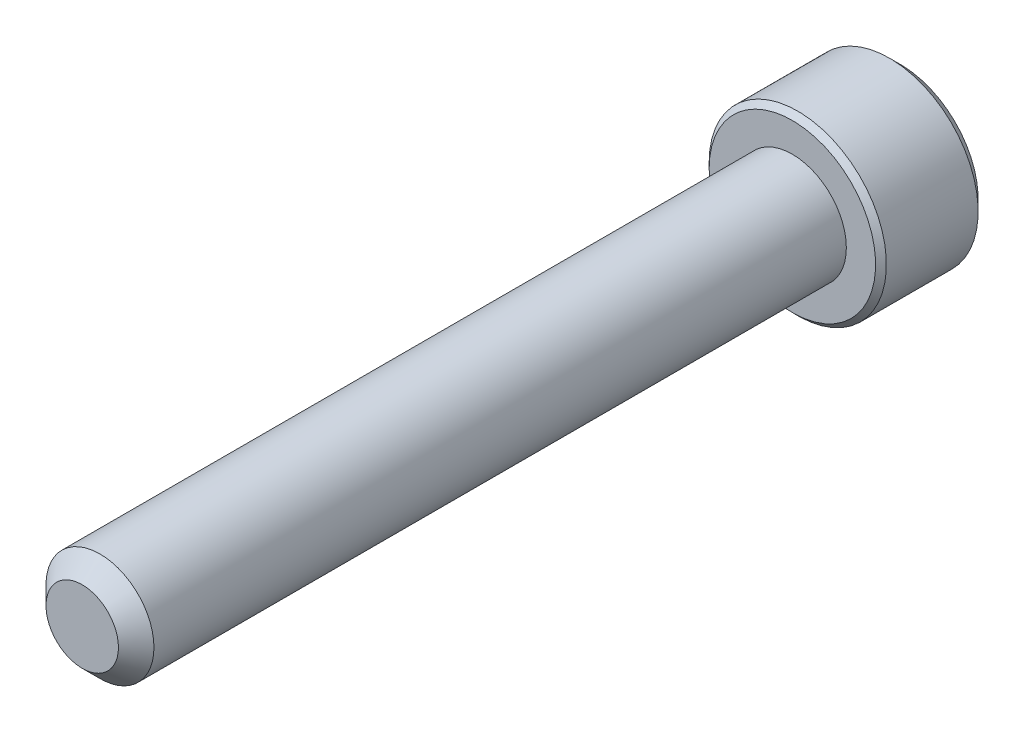
ISO-10303-21;
HEADER;
FILE_DESCRIPTION(('STEP AP214'),'2;1');
FILE_NAME('part.step','',(''),(''),'','','');
FILE_SCHEMA(('AUTOMOTIVE_DESIGN { 1 0 10303 214 1 1 1 1 }'));
ENDSEC;
DATA;
#1=APPLICATION_CONTEXT('core data for automotive mechanical design processes');
#2=APPLICATION_PROTOCOL_DEFINITION('international standard','automotive_design',2000,#1);
#3=PRODUCT_CONTEXT('',#1,'mechanical');
#4=PRODUCT('Part','Part','',(#3));
#5=PRODUCT_RELATED_PRODUCT_CATEGORY('part','',(#4));
#6=PRODUCT_DEFINITION_FORMATION('','',#4);
#7=PRODUCT_DEFINITION_CONTEXT('part definition',#1,'design');
#8=PRODUCT_DEFINITION('design','',#6,#7);
#9=PRODUCT_DEFINITION_SHAPE('','',#8);
#10=(LENGTH_UNIT() NAMED_UNIT(*) SI_UNIT(.MILLI.,.METRE.));
#11=(NAMED_UNIT(*) PLANE_ANGLE_UNIT() SI_UNIT($,.RADIAN.));
#12=(NAMED_UNIT(*) SI_UNIT($,.STERADIAN.) SOLID_ANGLE_UNIT());
#13=UNCERTAINTY_MEASURE_WITH_UNIT(LENGTH_MEASURE(1.E-05),#10,'distance_accuracy_value','');
#14=(GEOMETRIC_REPRESENTATION_CONTEXT(3) GLOBAL_UNCERTAINTY_ASSIGNED_CONTEXT((#13)) GLOBAL_UNIT_ASSIGNED_CONTEXT((#10,
#11,#12)) REPRESENTATION_CONTEXT('',''));
#15=CARTESIAN_POINT('',(0.,0.,0.));
#16=DIRECTION('',(0.,0.,1.));
#17=DIRECTION('',(1.,0.,0.));
#18=AXIS2_PLACEMENT_3D('',#15,#16,#17);
#19=CARTESIAN_POINT('',(0.,0.,-31.75));
#20=DIRECTION('',(0.,0.,1.));
#21=DIRECTION('',(1.,0.,0.));
#22=AXIS2_PLACEMENT_3D('',#19,#20,#21);
#23=CYLINDRICAL_SURFACE('',#22,2.413);
#24=CARTESIAN_POINT('',(0.,0.,-31.75));
#25=DIRECTION('',(0.,0.,-1.));
#26=DIRECTION('',(-1.,0.,0.));
#27=AXIS2_PLACEMENT_3D('',#24,#25,#26);
#28=CIRCLE('',#27,2.413);
#29=CARTESIAN_POINT('',(-2.413,0.,-31.75));
#30=VERTEX_POINT('',#29);
#31=EDGE_CURVE('E229',#30,#30,#28,.F.);
#32=ORIENTED_EDGE('',*,*,#31,.T.);
#33=EDGE_LOOP('',(#32));
#34=FACE_BOUND('',#33,.T.);
#35=CARTESIAN_POINT('',(0.,0.,-0.793749999999996));
#36=DIRECTION('',(0.,0.,1.));
#37=DIRECTION('',(1.,0.,0.));
#38=AXIS2_PLACEMENT_3D('',#35,#36,#37);
#39=CIRCLE('',#38,2.413);
#40=CARTESIAN_POINT('',(2.413,0.,-0.793749999999996));
#41=VERTEX_POINT('',#40);
#42=EDGE_CURVE('E116',#41,#41,#39,.F.);
#43=ORIENTED_EDGE('',*,*,#42,.T.);
#44=EDGE_LOOP('',(#43));
#45=FACE_BOUND('',#44,.T.);
#46=ADVANCED_FACE('F39',(#34,#45),#23,.T.);
#47=CARTESIAN_POINT('',(0.,0.,0.));
#48=DIRECTION('',(0.,0.,1.));
#49=DIRECTION('',(1.,0.,0.));
#50=AXIS2_PLACEMENT_3D('',#47,#48,#49);
#51=PLANE('',#50);
#52=CARTESIAN_POINT('',(0.,0.,0.));
#53=DIRECTION('',(0.,0.,1.));
#54=DIRECTION('',(1.,0.,0.));
#55=AXIS2_PLACEMENT_3D('',#52,#53,#54);
#56=CIRCLE('',#55,1.61925000000001);
#57=CARTESIAN_POINT('',(1.61925000000001,0.,0.));
#58=VERTEX_POINT('',#57);
#59=EDGE_CURVE('E227',#58,#58,#56,.T.);
#60=ORIENTED_EDGE('',*,*,#59,.T.);
#61=EDGE_LOOP('',(#60));
#62=FACE_BOUND('',#61,.T.);
#63=ADVANCED_FACE('F204',(#62),#51,.T.);
#64=CARTESIAN_POINT('',(0.,0.,0.));
#65=DIRECTION('',(0.,0.,-1.));
#66=DIRECTION('',(-1.,0.,0.));
#67=AXIS2_PLACEMENT_3D('',#64,#65,#66);
#68=CONICAL_SURFACE('',#67,1.61925000000001,0.785398163397447);
#69=ORIENTED_EDGE('',*,*,#42,.F.);
#70=EDGE_LOOP('',(#69));
#71=FACE_BOUND('',#70,.T.);
#72=ORIENTED_EDGE('',*,*,#59,.F.);
#73=EDGE_LOOP('',(#72));
#74=FACE_BOUND('',#73,.T.);
#75=ADVANCED_FACE('F210',(#71,#74),#68,.T.);
#76=CARTESIAN_POINT('',(0.,0.,-36.576));
#77=DIRECTION('',(0.,0.,1.));
#78=DIRECTION('',(1.,0.,0.));
#79=AXIS2_PLACEMENT_3D('',#76,#77,#78);
#80=CYLINDRICAL_SURFACE('',#79,3.9624);
#81=CARTESIAN_POINT('',(0.,0.,-31.9913));
#82=DIRECTION('',(0.,0.,-1.));
#83=DIRECTION('',(-1.,0.,0.));
#84=AXIS2_PLACEMENT_3D('',#81,#82,#83);
#85=CIRCLE('',#84,3.9624);
#86=CARTESIAN_POINT('',(-3.9624,0.,-31.9913));
#87=VERTEX_POINT('',#86);
#88=EDGE_CURVE('E48',#87,#87,#85,.T.);
#89=ORIENTED_EDGE('',*,*,#88,.T.);
#90=EDGE_LOOP('',(#89));
#91=FACE_BOUND('',#90,.T.);
#92=CARTESIAN_POINT('',(0.,0.,-36.0934));
#93=DIRECTION('',(0.,0.,-1.));
#94=DIRECTION('',(-1.,0.,0.));
#95=AXIS2_PLACEMENT_3D('',#92,#93,#94);
#96=CIRCLE('',#95,3.9624);
#97=CARTESIAN_POINT('',(-3.9624,0.,-36.0934));
#98=VERTEX_POINT('',#97);
#99=EDGE_CURVE('E185',#98,#98,#96,.F.);
#100=ORIENTED_EDGE('',*,*,#99,.T.);
#101=EDGE_LOOP('',(#100));
#102=FACE_BOUND('',#101,.T.);
#103=ADVANCED_FACE('F192',(#91,#102),#80,.T.);
#104=CARTESIAN_POINT('',(0.,0.,-36.576));
#105=DIRECTION('',(0.,0.,-1.));
#106=DIRECTION('',(-1.,0.,0.));
#107=AXIS2_PLACEMENT_3D('',#104,#105,#106);
#108=PLANE('',#107);
#109=CARTESIAN_POINT('',(0.,0.,-36.576));
#110=DIRECTION('',(0.,0.,-1.));
#111=DIRECTION('',(-1.,0.,0.));
#112=AXIS2_PLACEMENT_3D('',#109,#110,#111);
#113=CIRCLE('',#112,3.4798);
#114=CARTESIAN_POINT('',(-3.4798,0.,-36.576));
#115=VERTEX_POINT('',#114);
#116=EDGE_CURVE('E115',#115,#115,#113,.T.);
#117=ORIENTED_EDGE('',*,*,#116,.T.);
#118=EDGE_LOOP('',(#117));
#119=FACE_BOUND('',#118,.T.);
#120=CARTESIAN_POINT('',(0.,0.,-36.576));
#121=DIRECTION('',(0.,0.,-1.));
#122=DIRECTION('',(-1.,0.,0.));
#123=AXIS2_PLACEMENT_3D('',#120,#121,#122);
#124=CIRCLE('',#123,2.29135888084633);
#125=CARTESIAN_POINT('',(-1.984375,1.14567944042316,-36.576));
#126=VERTEX_POINT('',#125);
#127=CARTESIAN_POINT('',(0.,2.29135888084633,-36.576));
#128=VERTEX_POINT('',#127);
#129=EDGE_CURVE('E94',#126,#128,#124,.T.);
#130=ORIENTED_EDGE('',*,*,#129,.F.);
#131=CARTESIAN_POINT('',(-1.984375,-1.14567944042316,-36.576));
#132=VERTEX_POINT('',#131);
#133=EDGE_CURVE('E54',#132,#126,#124,.T.);
#134=ORIENTED_EDGE('',*,*,#133,.F.);
#135=CARTESIAN_POINT('',(0.,-2.29135888084633,-36.576));
#136=VERTEX_POINT('',#135);
#137=EDGE_CURVE('E301',#136,#132,#124,.T.);
#138=ORIENTED_EDGE('',*,*,#137,.F.);
#139=CARTESIAN_POINT('',(1.984375,-1.14567944042316,-36.576));
#140=VERTEX_POINT('',#139);
#141=EDGE_CURVE('E61',#140,#136,#124,.T.);
#142=ORIENTED_EDGE('',*,*,#141,.F.);
#143=CARTESIAN_POINT('',(1.984375,1.14567944042316,-36.576));
#144=VERTEX_POINT('',#143);
#145=EDGE_CURVE('E139',#144,#140,#124,.T.);
#146=ORIENTED_EDGE('',*,*,#145,.F.);
#147=EDGE_CURVE('E104',#128,#144,#124,.T.);
#148=ORIENTED_EDGE('',*,*,#147,.F.);
#149=EDGE_LOOP('',(#130,#134,#138,#142,#146,#148));
#150=FACE_BOUND('',#149,.T.);
#151=ADVANCED_FACE('F138',(#119,#150),#108,.T.);
#152=CARTESIAN_POINT('',(0.,0.,-31.75));
#153=DIRECTION('',(0.,0.,-1.));
#154=DIRECTION('',(-1.,0.,0.));
#155=AXIS2_PLACEMENT_3D('',#152,#153,#154);
#156=PLANE('',#155);
#157=CARTESIAN_POINT('',(0.,0.,-31.75));
#158=DIRECTION('',(0.,0.,-1.));
#159=DIRECTION('',(-1.,0.,0.));
#160=AXIS2_PLACEMENT_3D('',#157,#158,#159);
#161=CIRCLE('',#160,3.72109999999999);
#162=CARTESIAN_POINT('',(-3.72109999999999,0.,-31.75));
#163=VERTEX_POINT('',#162);
#164=EDGE_CURVE('E11',#163,#163,#161,.F.);
#165=ORIENTED_EDGE('',*,*,#164,.T.);
#166=EDGE_LOOP('',(#165));
#167=FACE_BOUND('',#166,.T.);
#168=ORIENTED_EDGE('',*,*,#31,.F.);
#169=EDGE_LOOP('',(#168));
#170=FACE_BOUND('',#169,.T.);
#171=ADVANCED_FACE('F318',(#167,#170),#156,.F.);
#172=CARTESIAN_POINT('',(0.,0.,-36.576));
#173=DIRECTION('',(0.,0.,-1.));
#174=DIRECTION('',(-1.,0.,0.));
#175=AXIS2_PLACEMENT_3D('',#172,#173,#174);
#176=CONICAL_SURFACE('',#175,2.29135888084633,0.78539816339745);
#177=ORIENTED_EDGE('',*,*,#147,.T.);
#178=CARTESIAN_POINT('',(-0.000199999999999366,2.29147435090016,-36.5761154787818));
#179=CARTESIAN_POINT('',(0.0680159951668032,2.25208982772757,-36.5367628522639));
#180=CARTESIAN_POINT('',(0.137372685106966,2.21204672412052,-36.4997213104462));
#181=CARTESIAN_POINT('',(0.278798800452186,2.13039431835551,-36.4318988584233));
#182=CARTESIAN_POINT('',(0.350881678736781,2.08877724917394,-36.4011556890918));
#183=CARTESIAN_POINT('',(0.496233397266004,2.00485839535392,-36.3484918888112));
#184=CARTESIAN_POINT('',(0.56946521248694,1.96257798712287,-36.32643887588));
#185=CARTESIAN_POINT('',(0.717541182594709,1.87708628592063,-36.2924614929439));
#186=CARTESIAN_POINT('',(0.792380812753428,1.83387760530244,-36.2805117560917));
#187=CARTESIAN_POINT('',(0.92136041454382,1.75941119748879,-36.2697300990819));
#188=CARTESIAN_POINT('',(0.975333715772447,1.72824969749539,-36.2681338990591));
#189=CARTESIAN_POINT('',(1.0831921185198,1.66597761963484,-36.2708218388653));
#190=CARTESIAN_POINT('',(1.13707718248553,1.63486706344893,-36.2751080403405));
#191=CARTESIAN_POINT('',(1.24433853824861,1.57293969082547,-36.2893168730135));
#192=CARTESIAN_POINT('',(1.29771419276014,1.54212324232506,-36.2992458104523));
#193=CARTESIAN_POINT('',(1.4035425174089,1.48102323060121,-36.3241950842745));
#194=CARTESIAN_POINT('',(1.45599525797111,1.45073962671789,-36.3392150303895));
#195=CARTESIAN_POINT('',(1.59035733896365,1.37316564308797,-36.3838078516357));
#196=CARTESIAN_POINT('',(1.67143335715833,1.32635638215845,-36.4167429959383));
#197=CARTESIAN_POINT('',(1.79064830672984,1.25752759893191,-36.4723424412022));
#198=CARTESIAN_POINT('',(1.829934924386,1.23484545965257,-36.4918775920519));
#199=CARTESIAN_POINT('',(1.90778036186805,1.18990137536713,-36.5327287381194));
#200=CARTESIAN_POINT('',(1.9463396111017,1.16763918244233,-36.5540436395683));
#201=CARTESIAN_POINT('',(1.984575,1.14556397036933,-36.5761154787818));
#202=B_SPLINE_CURVE_WITH_KNOTS('',3,(#178,#179,#180,#181,#182,#183,#184,#185,#186,#187,#188,
#189,#190,#191,#192,#193,#194,#195,#196,#197,#198,#199,#200,#201),.UNSPECIFIED.,.F.,.F.,(4,2,2,
2,2,2,2,2,2,2,2,4),(0.,0.264339630306623,0.530219665093692,0.791876416371461,1.05287424418109,
1.239639843932,1.42647091743853,1.61351120244035,1.80053715247541,2.09764209964316,
2.24579179873713,2.39385111134157),.UNSPECIFIED.);
#203=EDGE_CURVE('E109',#128,#144,#202,.T.);
#204=ORIENTED_EDGE('',*,*,#203,.F.);
#205=EDGE_LOOP('',(#177,#204));
#206=FACE_BOUND('',#205,.T.);
#207=ADVANCED_FACE('F110',(#206),#176,.F.);
#208=ORIENTED_EDGE('',*,*,#145,.T.);
#209=CARTESIAN_POINT('',(1.984375,-2.32063167832104,-37.3380122932909));
#210=CARTESIAN_POINT('',(1.984375,-2.26428478873706,-37.2951970726396));
#211=CARTESIAN_POINT('',(1.984375,-2.2076264404859,-37.2527851548598));
#212=CARTESIAN_POINT('',(1.984375,-2.09356244120114,-37.1689497614));
#213=CARTESIAN_POINT('',(1.984375,-2.03615660973826,-37.1275265314736));
#214=CARTESIAN_POINT('',(1.984375,-1.92005329549413,-37.0455556074651));
#215=CARTESIAN_POINT('',(1.984375,-1.86134925442763,-37.0050171714073));
#216=CARTESIAN_POINT('',(1.984375,-1.74295108528239,-36.9254176949279));
#217=CARTESIAN_POINT('',(1.984375,-1.68325702692775,-36.8863565510951));
#218=CARTESIAN_POINT('',(1.984375,-1.5591477373167,-36.807782507283));
#219=CARTESIAN_POINT('',(1.984375,-1.49466231059305,-36.7683799217084));
#220=CARTESIAN_POINT('',(1.984375,-1.36418150680542,-36.6921153086969));
#221=CARTESIAN_POINT('',(1.984375,-1.29818586193375,-36.6552537365827));
#222=CARTESIAN_POINT('',(1.984375,-1.16468832197213,-36.5848663044257));
#223=CARTESIAN_POINT('',(1.984375,-1.09719175474905,-36.5513304185629));
#224=CARTESIAN_POINT('',(1.984375,-0.960326048760511,-36.488338388333));
#225=CARTESIAN_POINT('',(1.984375,-0.890957548524539,-36.4588808733092));
#226=CARTESIAN_POINT('',(1.984375,-0.756350570592775,-36.4074431504382));
#227=CARTESIAN_POINT('',(1.984375,-0.691277091834666,-36.3850356001922));
#228=CARTESIAN_POINT('',(1.984375,-0.55953224434249,-36.345436438549));
#229=CARTESIAN_POINT('',(1.984375,-0.492860768840823,-36.3282451767239));
#230=CARTESIAN_POINT('',(1.984375,-0.359444340541038,-36.3002733107239));
#231=CARTESIAN_POINT('',(1.984375,-0.292723272440602,-36.2893806612626));
#232=CARTESIAN_POINT('',(1.984375,-0.15852847460885,-36.2742231339064));
#233=CARTESIAN_POINT('',(1.984375,-0.0910548851817921,-36.2699570406579));
#234=CARTESIAN_POINT('',(1.984375,0.0413650999137214,-36.2683854095573));
#235=CARTESIAN_POINT('',(1.984375,0.106308452967816,-36.2708174039186));
#236=CARTESIAN_POINT('',(1.984375,0.235655863007934,-36.2819201379429));
#237=CARTESIAN_POINT('',(1.984375,0.300059868095332,-36.2905914711624));
#238=CARTESIAN_POINT('',(1.984375,0.428953283964645,-36.3138407434725));
#239=CARTESIAN_POINT('',(1.984375,0.493424050458161,-36.3285204588315));
#240=CARTESIAN_POINT('',(1.984375,0.620952380240784,-36.3629955658159));
#241=CARTESIAN_POINT('',(1.984375,0.684010048840135,-36.3827905748402));
#242=CARTESIAN_POINT('',(1.984375,0.880940558550127,-36.4521008914478));
#243=CARTESIAN_POINT('',(1.984375,1.01205007104083,-36.509443011978));
#244=CARTESIAN_POINT('',(1.984375,1.26813381475398,-36.6369796743044));
#245=CARTESIAN_POINT('',(1.984375,1.39308407238678,-36.7072200707537));
#246=CARTESIAN_POINT('',(1.984375,1.57369086911653,-36.8168624553678));
#247=CARTESIAN_POINT('',(1.984375,1.63130328190224,-36.8531057512345));
#248=CARTESIAN_POINT('',(1.984375,1.74553911378007,-36.9271304425414));
#249=CARTESIAN_POINT('',(1.984375,1.80216245776213,-36.9649119540746));
#250=CARTESIAN_POINT('',(1.984375,1.91409137785656,-37.0414208659108));
#251=CARTESIAN_POINT('',(1.984375,1.96940390829637,-37.0801381432783));
#252=CARTESIAN_POINT('',(1.984375,2.07927192346537,-37.158601965305));
#253=CARTESIAN_POINT('',(1.984375,2.13382761241392,-37.1983482236772));
#254=CARTESIAN_POINT('',(1.984375,2.18806621147868,-37.2385161819212));
#255=B_SPLINE_CURVE_WITH_KNOTS('',3,(#209,#210,#211,#212,#213,#214,#215,#216,#217,#218,#219,
#220,#221,#222,#223,#224,#225,#226,#227,#228,#229,#230,#231,#232,#233,#234,#235,#236,#237,#238,
#239,#240,#241,#242,#243,#244,#245,#246,#247,#248,#249,#250,#251,#252,#253,#254),.UNSPECIFIED.,
.F.,.F.,(4,2,2,2,2,2,2,2,2,2,2,2,2,2,2,2,2,2,2,2,2,2,4),(0.,0.212308206697434,0.424668647567399,
0.638672731709372,0.852661807620632,1.07932739837562,1.30603350019038,1.53203394142884,
1.75795824321729,1.96424818305224,2.170551944454,2.37306294924567,2.57553680780813,
2.77019069742987,2.96486310718305,3.16297934082809,3.36108076055064,3.78913334543008,
4.21873824519345,4.4229122671498,4.62710172729376,4.82963956125529,5.03212163744054),.UNSPECIFIED.);
#256=EDGE_CURVE('E103',#144,#140,#255,.F.);
#257=ORIENTED_EDGE('',*,*,#256,.F.);
#258=EDGE_LOOP('',(#208,#257));
#259=FACE_BOUND('',#258,.T.);
#260=ADVANCED_FACE('F312',(#259),#176,.F.);
#261=ORIENTED_EDGE('',*,*,#141,.T.);
#262=CARTESIAN_POINT('',(1.984575,-1.14556397036933,-36.5761154787818));
#263=CARTESIAN_POINT('',(1.9163590048332,-1.18494849354192,-36.5367628522639));
#264=CARTESIAN_POINT('',(1.84700231489303,-1.22499159714897,-36.4997213104462));
#265=CARTESIAN_POINT('',(1.70557619954781,-1.30664400291398,-36.4318988584233));
#266=CARTESIAN_POINT('',(1.63349332126322,-1.34826107209555,-36.4011556890918));
#267=CARTESIAN_POINT('',(1.488141602734,-1.43217992591557,-36.3484918888112));
#268=CARTESIAN_POINT('',(1.41490978751306,-1.47446033414663,-36.32643887588));
#269=CARTESIAN_POINT('',(1.26683381740529,-1.55995203534886,-36.2924614929439));
#270=CARTESIAN_POINT('',(1.19199418724657,-1.60316071596705,-36.2805117560917));
#271=CARTESIAN_POINT('',(1.06301458545618,-1.6776271237807,-36.2697300990819));
#272=CARTESIAN_POINT('',(1.00904128422756,-1.7087886237741,-36.2681338990591));
#273=CARTESIAN_POINT('',(0.901182881480198,-1.77106070163465,-36.2708218388653));
#274=CARTESIAN_POINT('',(0.847297817514475,-1.80217125782056,-36.2751080403405));
#275=CARTESIAN_POINT('',(0.740036461751394,-1.86409863044402,-36.2893168730135));
#276=CARTESIAN_POINT('',(0.686660807239858,-1.89491507894443,-36.2992458104523));
#277=CARTESIAN_POINT('',(0.580832482591102,-1.95601509066828,-36.3241950842745));
#278=CARTESIAN_POINT('',(0.528379742028897,-1.9862986945516,-36.3392150303895));
#279=CARTESIAN_POINT('',(0.394017661036351,-2.06387267818152,-36.3838078516357));
#280=CARTESIAN_POINT('',(0.312941642841676,-2.11068193911104,-36.4167429959383));
#281=CARTESIAN_POINT('',(0.193726693270165,-2.17951072233758,-36.4723424412022));
#282=CARTESIAN_POINT('',(0.154440075614005,-2.20219286161692,-36.4918775920519));
#283=CARTESIAN_POINT('',(0.0765946381319534,-2.24713694590236,-36.5327287381194));
#284=CARTESIAN_POINT('',(0.0380353888983062,-2.26939913882716,-36.5540436395683));
#285=CARTESIAN_POINT('',(-0.000199999999997399,-2.29147435090016,-36.5761154787818));
#286=B_SPLINE_CURVE_WITH_KNOTS('',3,(#262,#263,#264,#265,#266,#267,#268,#269,#270,#271,#272,
#273,#274,#275,#276,#277,#278,#279,#280,#281,#282,#283,#284,#285),.UNSPECIFIED.,.F.,.F.,(4,2,2,
2,2,2,2,2,2,2,2,4),(0.,0.264339630306623,0.530219665093692,0.79187641637146,1.05287424418109,
1.239639843932,1.42647091743852,1.61351120244035,1.8005371524754,2.09764209964316,
2.24579179873713,2.39385111134157),.UNSPECIFIED.);
#287=EDGE_CURVE('E152',#140,#136,#286,.T.);
#288=ORIENTED_EDGE('',*,*,#287,.F.);
#289=EDGE_LOOP('',(#261,#288));
#290=FACE_BOUND('',#289,.T.);
#291=ADVANCED_FACE('F309',(#290),#176,.F.);
#292=ORIENTED_EDGE('',*,*,#137,.T.);
#293=CARTESIAN_POINT('',(0.000200000000000188,-2.29147435090017,-36.5761154787818));
#294=CARTESIAN_POINT('',(-0.0680159951668023,-2.25208982772757,-36.5367628522639));
#295=CARTESIAN_POINT('',(-0.137372685106965,-2.21204672412052,-36.4997213104462));
#296=CARTESIAN_POINT('',(-0.278798800452186,-2.13039431835551,-36.4318988584233));
#297=CARTESIAN_POINT('',(-0.350881678736781,-2.08877724917394,-36.4011556890918));
#298=CARTESIAN_POINT('',(-0.496233397266003,-2.00485839535392,-36.3484918888112));
#299=CARTESIAN_POINT('',(-0.569465212486939,-1.96257798712287,-36.32643887588));
#300=CARTESIAN_POINT('',(-0.717541182594709,-1.87708628592063,-36.2924614929439));
#301=CARTESIAN_POINT('',(-0.792380812753428,-1.83387760530244,-36.2805117560917));
#302=CARTESIAN_POINT('',(-0.92136041454382,-1.75941119748879,-36.2697300990819));
#303=CARTESIAN_POINT('',(-0.975333715772447,-1.72824969749539,-36.2681338990591));
#304=CARTESIAN_POINT('',(-1.08319211851981,-1.66597761963484,-36.2708218388653));
#305=CARTESIAN_POINT('',(-1.13707718248553,-1.63486706344893,-36.2751080403405));
#306=CARTESIAN_POINT('',(-1.24433853824861,-1.57293969082547,-36.2893168730135));
#307=CARTESIAN_POINT('',(-1.29771419276014,-1.54212324232506,-36.2992458104523));
#308=CARTESIAN_POINT('',(-1.4035425174089,-1.48102323060121,-36.3241950842745));
#309=CARTESIAN_POINT('',(-1.45599525797111,-1.45073962671789,-36.3392150303895));
#310=CARTESIAN_POINT('',(-1.59035733896365,-1.37316564308797,-36.3838078516357));
#311=CARTESIAN_POINT('',(-1.67143335715833,-1.32635638215845,-36.4167429959383));
#312=CARTESIAN_POINT('',(-1.79064830672984,-1.25752759893191,-36.4723424412022));
#313=CARTESIAN_POINT('',(-1.829934924386,-1.23484545965257,-36.4918775920519));
#314=CARTESIAN_POINT('',(-1.90778036186805,-1.18990137536713,-36.5327287381194));
#315=CARTESIAN_POINT('',(-1.9463396111017,-1.16763918244233,-36.5540436395683));
#316=CARTESIAN_POINT('',(-1.984575,-1.14556397036933,-36.5761154787818));
#317=B_SPLINE_CURVE_WITH_KNOTS('',3,(#293,#294,#295,#296,#297,#298,#299,#300,#301,#302,#303,
#304,#305,#306,#307,#308,#309,#310,#311,#312,#313,#314,#315,#316),.UNSPECIFIED.,.F.,.F.,(4,2,2,
2,2,2,2,2,2,2,2,4),(0.,0.264339630306623,0.530219665093693,0.791876416371462,1.0528742441811,
1.23963984393201,1.42647091743853,1.61351120244035,1.80053715247541,2.09764209964316,
2.24579179873713,2.39385111134157),.UNSPECIFIED.);
#318=EDGE_CURVE('E278',#136,#132,#317,.T.);
#319=ORIENTED_EDGE('',*,*,#318,.F.);
#320=EDGE_LOOP('',(#292,#319));
#321=FACE_BOUND('',#320,.T.);
#322=ADVANCED_FACE('F306',(#321),#176,.F.);
#323=ORIENTED_EDGE('',*,*,#133,.T.);
#324=CARTESIAN_POINT('',(-1.984375,-2.32063167841241,-37.3380122933603));
#325=CARTESIAN_POINT('',(-1.984375,-2.26428478882583,-37.2951970727064));
#326=CARTESIAN_POINT('',(-1.984375,-2.20762644057208,-37.2527851549239));
#327=CARTESIAN_POINT('',(-1.984375,-2.09356244128209,-37.1689497614587));
#328=CARTESIAN_POINT('',(-1.984375,-2.03615660981659,-37.1275265315296));
#329=CARTESIAN_POINT('',(-1.984375,-1.92005329556713,-37.0455556075158));
#330=CARTESIAN_POINT('',(-1.984375,-1.86134925449792,-37.0050171714553));
#331=CARTESIAN_POINT('',(-1.984375,-1.7429510853472,-36.9254176949706));
#332=CARTESIAN_POINT('',(-1.984375,-1.6832570269898,-36.8863565511353));
#333=CARTESIAN_POINT('',(-1.984375,-1.5591477373728,-36.8077825073177));
#334=CARTESIAN_POINT('',(-1.984375,-1.49466231064596,-36.7683799217402));
#335=CARTESIAN_POINT('',(-1.984375,-1.36418150685181,-36.6921153087231));
#336=CARTESIAN_POINT('',(-1.984375,-1.29818586197681,-36.6552537366062));
#337=CARTESIAN_POINT('',(-1.984375,-1.16468832200844,-36.584866304444));
#338=CARTESIAN_POINT('',(-1.984375,-1.09719175478193,-36.5513304185787));
#339=CARTESIAN_POINT('',(-1.984375,-0.960326048786342,-36.4883383883442));
#340=CARTESIAN_POINT('',(-1.984375,-0.89095754854675,-36.4588808733182));
#341=CARTESIAN_POINT('',(-1.984375,-0.756350570613437,-36.4074431504457));
#342=CARTESIAN_POINT('',(-1.984375,-0.691277091857561,-36.3850356001998));
#343=CARTESIAN_POINT('',(-1.984375,-0.559532244369928,-36.3454364385565));
#344=CARTESIAN_POINT('',(-1.984375,-0.492860768870572,-36.3282451767311));
#345=CARTESIAN_POINT('',(-1.984375,-0.359444340575336,-36.3002733107301));
#346=CARTESIAN_POINT('',(-1.984375,-0.292723272477136,-36.289380661268));
#347=CARTESIAN_POINT('',(-1.984375,-0.158528474649785,-36.2742231339098));
#348=CARTESIAN_POINT('',(-1.984375,-0.0910548852248932,-36.2699570406599));
#349=CARTESIAN_POINT('',(-1.984375,0.0413650998667322,-36.2683854095564));
#350=CARTESIAN_POINT('',(-1.984375,0.106308452919099,-36.2708174039161));
#351=CARTESIAN_POINT('',(-1.984375,0.23565586295594,-36.2819201379368));
#352=CARTESIAN_POINT('',(-1.984375,0.30005986804179,-36.2905914711544));
#353=CARTESIAN_POINT('',(-1.984375,0.428953283908045,-36.3138407434606));
#354=CARTESIAN_POINT('',(-1.984375,0.493424050400057,-36.3285204588175));
#355=CARTESIAN_POINT('',(-1.984375,0.620952380179823,-36.3629955657978));
#356=CARTESIAN_POINT('',(-1.984375,0.684010048777821,-36.3827905748199));
#357=CARTESIAN_POINT('',(-1.984375,0.88094055847436,-36.4521008914176));
#358=CARTESIAN_POINT('',(-1.984375,1.01205007095363,-36.5094430119387));
#359=CARTESIAN_POINT('',(-1.984375,1.26813381464481,-36.6369796742459));
#360=CARTESIAN_POINT('',(-1.984375,1.39308407226707,-36.707220070685));
#361=CARTESIAN_POINT('',(-1.984375,1.57369086898219,-36.8168624552843));
#362=CARTESIAN_POINT('',(-1.984375,1.63130328176362,-36.8531057511465));
#363=CARTESIAN_POINT('',(-1.984375,1.74553911363296,-36.9271304424442));
#364=CARTESIAN_POINT('',(-1.984375,1.80216245761081,-36.9649119539729));
#365=CARTESIAN_POINT('',(-1.984375,1.91409137769692,-37.0414208658));
#366=CARTESIAN_POINT('',(-1.984375,1.96940390813262,-37.0801381431629));
#367=CARTESIAN_POINT('',(-1.984375,2.07927192329342,-37.1586019651806));
#368=CARTESIAN_POINT('',(-1.984375,2.13382761223788,-37.1983482235483));
#369=CARTESIAN_POINT('',(-1.984375,2.18806621129856,-37.2385161817877));
#370=B_SPLINE_CURVE_WITH_KNOTS('',3,(#324,#325,#326,#327,#328,#329,#330,#331,#332,#333,#334,
#335,#336,#337,#338,#339,#340,#341,#342,#343,#344,#345,#346,#347,#348,#349,#350,#351,#352,#353,
#354,#355,#356,#357,#358,#359,#360,#361,#362,#363,#364,#365,#366,#367,#368,#369),.UNSPECIFIED.,
.F.,.F.,(4,2,2,2,2,2,2,2,2,2,2,2,2,2,2,2,2,2,2,2,2,2,4),(0.,0.212308206708487,0.424668647589504,
0.638672731742732,0.852661807665253,1.07932739843287,1.30603350026029,1.53203394151128,
1.75795824331225,1.96424818314072,2.170551944536,2.37306294932147,2.57553680787772,
2.77019069749411,2.96486310724195,3.16297934088121,3.36108076059799,3.78913334543527,
4.21873824515619,4.4229122670944,4.62710172722023,4.82963956116387,5.03212163733122),.UNSPECIFIED.);
#371=EDGE_CURVE('E127',#132,#126,#370,.T.);
#372=ORIENTED_EDGE('',*,*,#371,.F.);
#373=EDGE_LOOP('',(#323,#372));
#374=FACE_BOUND('',#373,.T.);
#375=ADVANCED_FACE('F325',(#374),#176,.F.);
#376=ORIENTED_EDGE('',*,*,#129,.T.);
#377=CARTESIAN_POINT('',(-1.984575,1.14556397036933,-36.5761154787818));
#378=CARTESIAN_POINT('',(-1.9163590048332,1.18494849354192,-36.5367628522639));
#379=CARTESIAN_POINT('',(-1.84700231489304,1.22499159714897,-36.4997213104462));
#380=CARTESIAN_POINT('',(-1.70557619954781,1.30664400291398,-36.4318988584233));
#381=CARTESIAN_POINT('',(-1.63349332126322,1.34826107209555,-36.4011556890918));
#382=CARTESIAN_POINT('',(-1.488141602734,1.43217992591557,-36.3484918888112));
#383=CARTESIAN_POINT('',(-1.41490978751306,1.47446033414663,-36.32643887588));
#384=CARTESIAN_POINT('',(-1.26683381740529,1.55995203534886,-36.2924614929439));
#385=CARTESIAN_POINT('',(-1.19199418724657,1.60316071596705,-36.2805117560917));
#386=CARTESIAN_POINT('',(-1.06301458545618,1.6776271237807,-36.2697300990819));
#387=CARTESIAN_POINT('',(-1.00904128422755,1.7087886237741,-36.2681338990591));
#388=CARTESIAN_POINT('',(-0.901182881480195,1.77106070163465,-36.2708218388653));
#389=CARTESIAN_POINT('',(-0.847297817514472,1.80217125782056,-36.2751080403405));
#390=CARTESIAN_POINT('',(-0.740036461751392,1.86409863044402,-36.2893168730135));
#391=CARTESIAN_POINT('',(-0.686660807239856,1.89491507894443,-36.2992458104523));
#392=CARTESIAN_POINT('',(-0.5808324825911,1.95601509066828,-36.3241950842745));
#393=CARTESIAN_POINT('',(-0.528379742028895,1.9862986945516,-36.3392150303895));
#394=CARTESIAN_POINT('',(-0.394017661036349,2.06387267818152,-36.3838078516357));
#395=CARTESIAN_POINT('',(-0.312941642841675,2.11068193911104,-36.4167429959383));
#396=CARTESIAN_POINT('',(-0.193726693270161,2.17951072233758,-36.4723424412022));
#397=CARTESIAN_POINT('',(-0.154440075614,2.20219286161692,-36.4918775920519));
#398=CARTESIAN_POINT('',(-0.0765946381319484,2.24713694590236,-36.5327287381194));
#399=CARTESIAN_POINT('',(-0.0380353888983028,2.26939913882716,-36.5540436395683));
#400=CARTESIAN_POINT('',(0.000199999999998684,2.29147435090016,-36.5761154787818));
#401=B_SPLINE_CURVE_WITH_KNOTS('',3,(#377,#378,#379,#380,#381,#382,#383,#384,#385,#386,#387,
#388,#389,#390,#391,#392,#393,#394,#395,#396,#397,#398,#399,#400),.UNSPECIFIED.,.F.,.F.,(4,2,2,
2,2,2,2,2,2,2,2,4),(0.,0.264339630306623,0.530219665093693,0.791876416371462,1.05287424418109,
1.23963984393201,1.42647091743853,1.61351120244035,1.80053715247541,2.09764209964316,
2.24579179873713,2.39385111134157),.UNSPECIFIED.);
#402=EDGE_CURVE('E98',#126,#128,#401,.T.);
#403=ORIENTED_EDGE('',*,*,#402,.F.);
#404=EDGE_LOOP('',(#376,#403));
#405=FACE_BOUND('',#404,.T.);
#406=ADVANCED_FACE('F96',(#405),#176,.F.);
#407=CARTESIAN_POINT('',(1.984375,3.43703832126949,-33.5994375));
#408=DIRECTION('',(0.,0.,-1.));
#409=DIRECTION('',(-1.,0.,0.));
#410=AXIS2_PLACEMENT_3D('',#407,#408,#409);
#411=PLANE('',#410);
#412=DIRECTION('',(0.866025403784439,0.5,0.));
#413=VECTOR('',#412,1.);
#414=CARTESIAN_POINT('',(-1.984375,1.14567944042316,-33.5994375));
#415=LINE('',#414,#413);
#416=CARTESIAN_POINT('',(-1.984375,1.14567944042316,-33.5994375));
#417=VERTEX_POINT('',#416);
#418=CARTESIAN_POINT('',(0.,2.29135888084633,-33.5994375));
#419=VERTEX_POINT('',#418);
#420=EDGE_CURVE('E126',#417,#419,#415,.T.);
#421=ORIENTED_EDGE('',*,*,#420,.T.);
#422=DIRECTION('',(0.866025403784439,-0.5,0.));
#423=VECTOR('',#422,1.);
#424=CARTESIAN_POINT('',(0.,2.29135888084633,-33.5994375));
#425=LINE('',#424,#423);
#426=CARTESIAN_POINT('',(1.984375,1.14567944042316,-33.5994375));
#427=VERTEX_POINT('',#426);
#428=EDGE_CURVE('E131',#419,#427,#425,.T.);
#429=ORIENTED_EDGE('',*,*,#428,.T.);
#430=DIRECTION('',(0.,-1.,0.));
#431=VECTOR('',#430,1.);
#432=CARTESIAN_POINT('',(1.984375,1.14567944042316,-33.5994375));
#433=LINE('',#432,#431);
#434=CARTESIAN_POINT('',(1.984375,-1.14567944042316,-33.5994375));
#435=VERTEX_POINT('',#434);
#436=EDGE_CURVE('E260',#427,#435,#433,.T.);
#437=ORIENTED_EDGE('',*,*,#436,.T.);
#438=DIRECTION('',(-0.866025403784439,-0.5,0.));
#439=VECTOR('',#438,1.);
#440=CARTESIAN_POINT('',(1.984375,-1.14567944042316,-33.5994375));
#441=LINE('',#440,#439);
#442=CARTESIAN_POINT('',(0.,-2.29135888084633,-33.5994375));
#443=VERTEX_POINT('',#442);
#444=EDGE_CURVE('E256',#435,#443,#441,.T.);
#445=ORIENTED_EDGE('',*,*,#444,.T.);
#446=DIRECTION('',(-0.866025403784439,0.5,0.));
#447=VECTOR('',#446,1.);
#448=CARTESIAN_POINT('',(0.,-2.29135888084633,-33.5994375));
#449=LINE('',#448,#447);
#450=CARTESIAN_POINT('',(-1.984375,-1.14567944042316,-33.5994375));
#451=VERTEX_POINT('',#450);
#452=EDGE_CURVE('E252',#443,#451,#449,.T.);
#453=ORIENTED_EDGE('',*,*,#452,.T.);
#454=DIRECTION('',(0.,1.,0.));
#455=VECTOR('',#454,1.);
#456=CARTESIAN_POINT('',(-1.984375,-1.14567944042316,-33.5994375));
#457=LINE('',#456,#455);
#458=EDGE_CURVE('E135',#451,#417,#457,.T.);
#459=ORIENTED_EDGE('',*,*,#458,.T.);
#460=EDGE_LOOP('',(#421,#429,#437,#445,#453,#459));
#461=FACE_BOUND('',#460,.T.);
#462=ADVANCED_FACE('F172',(#461),#411,.T.);
#463=CARTESIAN_POINT('',(0.,2.29135888084633,-33.5994375));
#464=DIRECTION('',(0.5,0.866025403784439,0.));
#465=DIRECTION('',(-0.866025403784439,0.5,0.));
#466=AXIS2_PLACEMENT_3D('',#463,#464,#465);
#467=PLANE('',#466);
#468=DIRECTION('',(0.,0.,-1.));
#469=VECTOR('',#468,1.);
#470=CARTESIAN_POINT('',(0.,2.29135888084633,-33.5994375));
#471=LINE('',#470,#469);
#472=EDGE_CURVE('E122',#419,#128,#471,.T.);
#473=ORIENTED_EDGE('',*,*,#472,.T.);
#474=ORIENTED_EDGE('',*,*,#203,.T.);
#475=DIRECTION('',(0.,0.,-1.));
#476=VECTOR('',#475,1.);
#477=CARTESIAN_POINT('',(1.984375,1.14567944042316,-33.5994375));
#478=LINE('',#477,#476);
#479=EDGE_CURVE('E134',#427,#144,#478,.T.);
#480=ORIENTED_EDGE('',*,*,#479,.F.);
#481=ORIENTED_EDGE('',*,*,#428,.F.);
#482=EDGE_LOOP('',(#473,#474,#480,#481));
#483=FACE_BOUND('',#482,.T.);
#484=ADVANCED_FACE('F129',(#483),#467,.F.);
#485=CARTESIAN_POINT('',(1.984375,1.14567944042316,-33.5994375));
#486=DIRECTION('',(1.,0.,0.));
#487=DIRECTION('',(0.,0.,-1.));
#488=AXIS2_PLACEMENT_3D('',#485,#486,#487);
#489=PLANE('',#488);
#490=ORIENTED_EDGE('',*,*,#479,.T.);
#491=ORIENTED_EDGE('',*,*,#256,.T.);
#492=DIRECTION('',(0.,0.,-1.));
#493=VECTOR('',#492,1.);
#494=CARTESIAN_POINT('',(1.984375,-1.14567944042316,-33.5994375));
#495=LINE('',#494,#493);
#496=EDGE_CURVE('E236',#435,#140,#495,.T.);
#497=ORIENTED_EDGE('',*,*,#496,.F.);
#498=ORIENTED_EDGE('',*,*,#436,.F.);
#499=EDGE_LOOP('',(#490,#491,#497,#498));
#500=FACE_BOUND('',#499,.T.);
#501=ADVANCED_FACE('F161',(#500),#489,.F.);
#502=CARTESIAN_POINT('',(1.984375,-1.14567944042316,-33.5994375));
#503=DIRECTION('',(0.5,-0.866025403784439,0.));
#504=DIRECTION('',(0.866025403784439,0.5,0.));
#505=AXIS2_PLACEMENT_3D('',#502,#503,#504);
#506=PLANE('',#505);
#507=ORIENTED_EDGE('',*,*,#496,.T.);
#508=ORIENTED_EDGE('',*,*,#287,.T.);
#509=DIRECTION('',(0.,0.,-1.));
#510=VECTOR('',#509,1.);
#511=CARTESIAN_POINT('',(0.,-2.29135888084633,-33.5994375));
#512=LINE('',#511,#510);
#513=EDGE_CURVE('E240',#443,#136,#512,.T.);
#514=ORIENTED_EDGE('',*,*,#513,.F.);
#515=ORIENTED_EDGE('',*,*,#444,.F.);
#516=EDGE_LOOP('',(#507,#508,#514,#515));
#517=FACE_BOUND('',#516,.T.);
#518=ADVANCED_FACE('F165',(#517),#506,.F.);
#519=CARTESIAN_POINT('',(0.,-2.29135888084633,-33.5994375));
#520=DIRECTION('',(-0.5,-0.866025403784439,0.));
#521=DIRECTION('',(0.866025403784439,-0.5,0.));
#522=AXIS2_PLACEMENT_3D('',#519,#520,#521);
#523=PLANE('',#522);
#524=ORIENTED_EDGE('',*,*,#513,.T.);
#525=ORIENTED_EDGE('',*,*,#318,.T.);
#526=DIRECTION('',(0.,0.,-1.));
#527=VECTOR('',#526,1.);
#528=CARTESIAN_POINT('',(-1.984375,-1.14567944042316,-33.5994375));
#529=LINE('',#528,#527);
#530=EDGE_CURVE('E244',#451,#132,#529,.T.);
#531=ORIENTED_EDGE('',*,*,#530,.F.);
#532=ORIENTED_EDGE('',*,*,#452,.F.);
#533=EDGE_LOOP('',(#524,#525,#531,#532));
#534=FACE_BOUND('',#533,.T.);
#535=ADVANCED_FACE('F286',(#534),#523,.F.);
#536=CARTESIAN_POINT('',(-1.984375,-1.14567944042316,-33.5994375));
#537=DIRECTION('',(-1.,0.,0.));
#538=DIRECTION('',(0.,-1.,0.));
#539=AXIS2_PLACEMENT_3D('',#536,#537,#538);
#540=PLANE('',#539);
#541=ORIENTED_EDGE('',*,*,#530,.T.);
#542=ORIENTED_EDGE('',*,*,#371,.T.);
#543=DIRECTION('',(0.,0.,-1.));
#544=VECTOR('',#543,1.);
#545=CARTESIAN_POINT('',(-1.984375,1.14567944042316,-33.5994375));
#546=LINE('',#545,#544);
#547=EDGE_CURVE('E124',#417,#126,#546,.T.);
#548=ORIENTED_EDGE('',*,*,#547,.F.);
#549=ORIENTED_EDGE('',*,*,#458,.F.);
#550=EDGE_LOOP('',(#541,#542,#548,#549));
#551=FACE_BOUND('',#550,.T.);
#552=ADVANCED_FACE('F283',(#551),#540,.F.);
#553=CARTESIAN_POINT('',(-1.984375,1.14567944042316,-33.5994375));
#554=DIRECTION('',(-0.5,0.866025403784439,0.));
#555=DIRECTION('',(-0.866025403784439,-0.5,0.));
#556=AXIS2_PLACEMENT_3D('',#553,#554,#555);
#557=PLANE('',#556);
#558=ORIENTED_EDGE('',*,*,#547,.T.);
#559=ORIENTED_EDGE('',*,*,#402,.T.);
#560=ORIENTED_EDGE('',*,*,#472,.F.);
#561=ORIENTED_EDGE('',*,*,#420,.F.);
#562=EDGE_LOOP('',(#558,#559,#560,#561));
#563=FACE_BOUND('',#562,.T.);
#564=ADVANCED_FACE('F120',(#563),#557,.F.);
#565=CARTESIAN_POINT('',(0.,0.,-36.576));
#566=DIRECTION('',(0.,0.,1.));
#567=DIRECTION('',(1.,0.,0.));
#568=AXIS2_PLACEMENT_3D('',#565,#566,#567);
#569=CONICAL_SURFACE('',#568,3.4798,0.785398163397447);
#570=ORIENTED_EDGE('',*,*,#99,.F.);
#571=EDGE_LOOP('',(#570));
#572=FACE_BOUND('',#571,.T.);
#573=ORIENTED_EDGE('',*,*,#116,.F.);
#574=EDGE_LOOP('',(#573));
#575=FACE_BOUND('',#574,.T.);
#576=ADVANCED_FACE('F196',(#572,#575),#569,.T.);
#577=CARTESIAN_POINT('',(0.,0.,-31.9913));
#578=DIRECTION('',(0.,0.,-1.));
#579=DIRECTION('',(-1.,0.,0.));
#580=AXIS2_PLACEMENT_3D('',#577,#578,#579);
#581=CONICAL_SURFACE('',#580,3.9624,0.785398163397445);
#582=ORIENTED_EDGE('',*,*,#164,.F.);
#583=EDGE_LOOP('',(#582));
#584=FACE_BOUND('',#583,.T.);
#585=ORIENTED_EDGE('',*,*,#88,.F.);
#586=EDGE_LOOP('',(#585));
#587=FACE_BOUND('',#586,.T.);
#588=ADVANCED_FACE('F41',(#584,#587),#581,.T.);
#589=CLOSED_SHELL('',(#46,#63,#75,#103,#151,#171,#207,#260,#291,#322,#375,#406,#462,#484,#501,
#518,#535,#552,#564,#576,#588));
#590=MANIFOLD_SOLID_BREP('B2',#589);
#591=ADVANCED_BREP_SHAPE_REPRESENTATION('',(#18,#590),#14);
#592=SHAPE_DEFINITION_REPRESENTATION(#9,#591);
ENDSEC;
END-ISO-10303-21;
